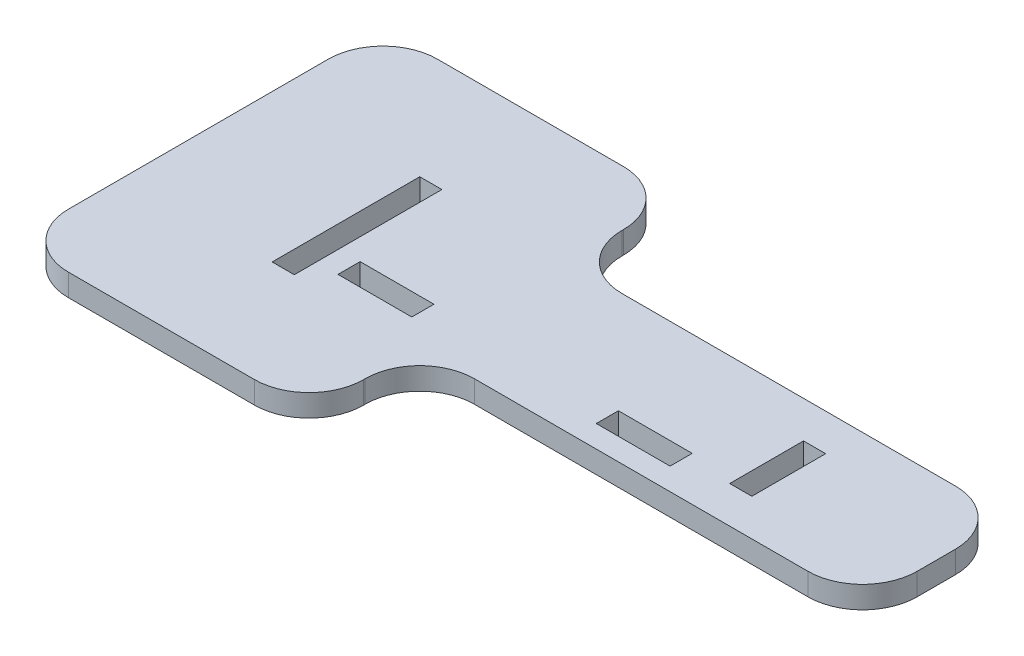
ISO-10303-21;
HEADER;
FILE_DESCRIPTION(('STEP AP214'),'2;1');
FILE_NAME('part.step','',(''),(''),'','','');
FILE_SCHEMA(('AUTOMOTIVE_DESIGN { 1 0 10303 214 1 1 1 1 }'));
ENDSEC;
DATA;
#1=APPLICATION_CONTEXT('core data for automotive mechanical design processes');
#2=APPLICATION_PROTOCOL_DEFINITION('international standard','automotive_design',2000,#1);
#3=PRODUCT_CONTEXT('',#1,'mechanical');
#4=PRODUCT('Part','Part','',(#3));
#5=PRODUCT_RELATED_PRODUCT_CATEGORY('part','',(#4));
#6=PRODUCT_DEFINITION_FORMATION('','',#4);
#7=PRODUCT_DEFINITION_CONTEXT('part definition',#1,'design');
#8=PRODUCT_DEFINITION('design','',#6,#7);
#9=PRODUCT_DEFINITION_SHAPE('','',#8);
#10=(LENGTH_UNIT() NAMED_UNIT(*) SI_UNIT(.MILLI.,.METRE.));
#11=(NAMED_UNIT(*) PLANE_ANGLE_UNIT() SI_UNIT($,.RADIAN.));
#12=(NAMED_UNIT(*) SI_UNIT($,.STERADIAN.) SOLID_ANGLE_UNIT());
#13=UNCERTAINTY_MEASURE_WITH_UNIT(LENGTH_MEASURE(1.E-05),#10,'distance_accuracy_value','');
#14=(GEOMETRIC_REPRESENTATION_CONTEXT(3) GLOBAL_UNCERTAINTY_ASSIGNED_CONTEXT((#13)) GLOBAL_UNIT_ASSIGNED_CONTEXT((#10,
#11,#12)) REPRESENTATION_CONTEXT('',''));
#15=CARTESIAN_POINT('',(0.,0.,0.));
#16=DIRECTION('',(0.,0.,1.));
#17=DIRECTION('',(1.,0.,0.));
#18=AXIS2_PLACEMENT_3D('',#15,#16,#17);
#19=CARTESIAN_POINT('',(0.,3.,0.));
#20=DIRECTION('',(1.,0.,0.));
#21=DIRECTION('',(0.,0.,-1.));
#22=AXIS2_PLACEMENT_3D('',#19,#20,#21);
#23=PLANE('',#22);
#24=DIRECTION('',(0.,0.,1.));
#25=VECTOR('',#24,1.);
#26=CARTESIAN_POINT('',(0.,3.,0.));
#27=LINE('',#26,#25);
#28=CARTESIAN_POINT('',(0.,3.,-42.6));
#29=VERTEX_POINT('',#28);
#30=CARTESIAN_POINT('',(0.,3.,-7.4));
#31=VERTEX_POINT('',#30);
#32=EDGE_CURVE('E400',#29,#31,#27,.T.);
#33=ORIENTED_EDGE('',*,*,#32,.F.);
#34=DIRECTION('',(0.,-1.,0.));
#35=VECTOR('',#34,1.);
#36=CARTESIAN_POINT('',(0.,3.,-42.6));
#37=LINE('',#36,#35);
#38=CARTESIAN_POINT('',(0.,0.,-42.6));
#39=VERTEX_POINT('',#38);
#40=EDGE_CURVE('E425',#29,#39,#37,.T.);
#41=ORIENTED_EDGE('',*,*,#40,.T.);
#42=DIRECTION('',(0.,0.,1.));
#43=VECTOR('',#42,1.);
#44=CARTESIAN_POINT('',(0.,0.,0.));
#45=LINE('',#44,#43);
#46=CARTESIAN_POINT('',(0.,0.,-7.4));
#47=VERTEX_POINT('',#46);
#48=EDGE_CURVE('E383',#39,#47,#45,.T.);
#49=ORIENTED_EDGE('',*,*,#48,.T.);
#50=DIRECTION('',(0.,-1.,0.));
#51=VECTOR('',#50,1.);
#52=CARTESIAN_POINT('',(0.,3.,-7.4));
#53=LINE('',#52,#51);
#54=EDGE_CURVE('E413',#47,#31,#53,.F.);
#55=ORIENTED_EDGE('',*,*,#54,.T.);
#56=EDGE_LOOP('',(#33,#41,#49,#55));
#57=FACE_BOUND('',#56,.T.);
#58=ADVANCED_FACE('F33',(#57),#23,.F.);
#59=CARTESIAN_POINT('',(0.,3.,0.));
#60=DIRECTION('',(0.,0.,-1.));
#61=DIRECTION('',(-1.,0.,0.));
#62=AXIS2_PLACEMENT_3D('',#59,#60,#61);
#63=PLANE('',#62);
#64=DIRECTION('',(1.,0.,0.));
#65=VECTOR('',#64,1.);
#66=CARTESIAN_POINT('',(0.,3.,0.));
#67=LINE('',#66,#65);
#68=CARTESIAN_POINT('',(7.4,3.,0.));
#69=VERTEX_POINT('',#68);
#70=CARTESIAN_POINT('',(32.6,3.,0.));
#71=VERTEX_POINT('',#70);
#72=EDGE_CURVE('E403',#69,#71,#67,.T.);
#73=ORIENTED_EDGE('',*,*,#72,.F.);
#74=DIRECTION('',(0.,-1.,0.));
#75=VECTOR('',#74,1.);
#76=CARTESIAN_POINT('',(7.4,3.,0.));
#77=LINE('',#76,#75);
#78=CARTESIAN_POINT('',(7.4,0.,0.));
#79=VERTEX_POINT('',#78);
#80=EDGE_CURVE('E459',#69,#79,#77,.T.);
#81=ORIENTED_EDGE('',*,*,#80,.T.);
#82=DIRECTION('',(1.,0.,0.));
#83=VECTOR('',#82,1.);
#84=CARTESIAN_POINT('',(0.,0.,0.));
#85=LINE('',#84,#83);
#86=CARTESIAN_POINT('',(32.6,0.,0.));
#87=VERTEX_POINT('',#86);
#88=EDGE_CURVE('E416',#79,#87,#85,.T.);
#89=ORIENTED_EDGE('',*,*,#88,.T.);
#90=DIRECTION('',(0.,1.,0.));
#91=VECTOR('',#90,1.);
#92=CARTESIAN_POINT('',(32.6,3.,0.));
#93=LINE('',#92,#91);
#94=EDGE_CURVE('E456',#87,#71,#93,.T.);
#95=ORIENTED_EDGE('',*,*,#94,.T.);
#96=EDGE_LOOP('',(#73,#81,#89,#95));
#97=FACE_BOUND('',#96,.T.);
#98=ADVANCED_FACE('F515',(#97),#63,.F.);
#99=CARTESIAN_POINT('',(100.,3.,0.));
#100=DIRECTION('',(-1.,0.,0.));
#101=DIRECTION('',(0.,0.,1.));
#102=AXIS2_PLACEMENT_3D('',#99,#100,#101);
#103=PLANE('',#102);
#104=DIRECTION('',(0.,0.,-1.));
#105=VECTOR('',#104,1.);
#106=CARTESIAN_POINT('',(100.,0.,0.));
#107=LINE('',#106,#105);
#108=CARTESIAN_POINT('',(100.,0.,-22.4));
#109=VERTEX_POINT('',#108);
#110=CARTESIAN_POINT('',(100.,0.,-27.6));
#111=VERTEX_POINT('',#110);
#112=EDGE_CURVE('E419',#109,#111,#107,.T.);
#113=ORIENTED_EDGE('',*,*,#112,.T.);
#114=DIRECTION('',(0.,1.,0.));
#115=VECTOR('',#114,1.);
#116=CARTESIAN_POINT('',(100.,3.,-27.6));
#117=LINE('',#116,#115);
#118=CARTESIAN_POINT('',(100.,3.,-27.6));
#119=VERTEX_POINT('',#118);
#120=EDGE_CURVE('E464',#111,#119,#117,.T.);
#121=ORIENTED_EDGE('',*,*,#120,.T.);
#122=DIRECTION('',(0.,0.,-1.));
#123=VECTOR('',#122,1.);
#124=CARTESIAN_POINT('',(100.,3.,0.));
#125=LINE('',#124,#123);
#126=CARTESIAN_POINT('',(100.,3.,-22.4));
#127=VERTEX_POINT('',#126);
#128=EDGE_CURVE('E407',#127,#119,#125,.T.);
#129=ORIENTED_EDGE('',*,*,#128,.F.);
#130=DIRECTION('',(0.,1.,0.));
#131=VECTOR('',#130,1.);
#132=CARTESIAN_POINT('',(100.,3.,-22.4));
#133=LINE('',#132,#131);
#134=EDGE_CURVE('E462',#127,#109,#133,.F.);
#135=ORIENTED_EDGE('',*,*,#134,.T.);
#136=EDGE_LOOP('',(#113,#121,#129,#135));
#137=FACE_BOUND('',#136,.T.);
#138=ADVANCED_FACE('F558',(#137),#103,.F.);
#139=CARTESIAN_POINT('',(0.,3.,-50.));
#140=DIRECTION('',(0.,0.,1.));
#141=DIRECTION('',(1.,0.,0.));
#142=AXIS2_PLACEMENT_3D('',#139,#140,#141);
#143=PLANE('',#142);
#144=DIRECTION('',(-1.,0.,0.));
#145=VECTOR('',#144,1.);
#146=CARTESIAN_POINT('',(0.,0.,-50.));
#147=LINE('',#146,#145);
#148=CARTESIAN_POINT('',(32.6,0.,-50.));
#149=VERTEX_POINT('',#148);
#150=CARTESIAN_POINT('',(7.39999999999998,0.,-50.));
#151=VERTEX_POINT('',#150);
#152=EDGE_CURVE('E404',#149,#151,#147,.T.);
#153=ORIENTED_EDGE('',*,*,#152,.T.);
#154=DIRECTION('',(0.,-1.,0.));
#155=VECTOR('',#154,1.);
#156=CARTESIAN_POINT('',(7.39999999999998,3.,-50.));
#157=LINE('',#156,#155);
#158=CARTESIAN_POINT('',(7.39999999999998,3.,-50.));
#159=VERTEX_POINT('',#158);
#160=EDGE_CURVE('E442',#151,#159,#157,.F.);
#161=ORIENTED_EDGE('',*,*,#160,.T.);
#162=DIRECTION('',(-1.,0.,0.));
#163=VECTOR('',#162,1.);
#164=CARTESIAN_POINT('',(0.,3.,-50.));
#165=LINE('',#164,#163);
#166=CARTESIAN_POINT('',(32.6,3.,-50.));
#167=VERTEX_POINT('',#166);
#168=EDGE_CURVE('E410',#167,#159,#165,.T.);
#169=ORIENTED_EDGE('',*,*,#168,.F.);
#170=DIRECTION('',(0.,1.,0.));
#171=VECTOR('',#170,1.);
#172=CARTESIAN_POINT('',(32.6,3.,-50.));
#173=LINE('',#172,#171);
#174=EDGE_CURVE('E440',#167,#149,#173,.F.);
#175=ORIENTED_EDGE('',*,*,#174,.T.);
#176=EDGE_LOOP('',(#153,#161,#169,#175));
#177=FACE_BOUND('',#176,.T.);
#178=ADVANCED_FACE('F531',(#177),#143,.F.);
#179=CARTESIAN_POINT('',(0.,3.,0.));
#180=DIRECTION('',(0.,-1.,0.));
#181=DIRECTION('',(0.,0.,-1.));
#182=AXIS2_PLACEMENT_3D('',#179,#180,#181);
#183=PLANE('',#182);
#184=DIRECTION('',(-1.,0.,0.));
#185=VECTOR('',#184,1.);
#186=CARTESIAN_POINT('',(25.9197070599803,3.,-18.));
#187=LINE('',#186,#185);
#188=CARTESIAN_POINT('',(35.9197070599803,3.,-18.));
#189=VERTEX_POINT('',#188);
#190=CARTESIAN_POINT('',(25.9197070599803,3.,-18.));
#191=VERTEX_POINT('',#190);
#192=EDGE_CURVE('E253',#189,#191,#187,.T.);
#193=ORIENTED_EDGE('',*,*,#192,.T.);
#194=DIRECTION('',(0.,0.,-1.));
#195=VECTOR('',#194,1.);
#196=CARTESIAN_POINT('',(25.9197070599803,3.,-18.));
#197=LINE('',#196,#195);
#198=CARTESIAN_POINT('',(25.9197070599803,3.,-21.));
#199=VERTEX_POINT('',#198);
#200=EDGE_CURVE('E245',#191,#199,#197,.T.);
#201=ORIENTED_EDGE('',*,*,#200,.T.);
#202=DIRECTION('',(1.,0.,0.));
#203=VECTOR('',#202,1.);
#204=CARTESIAN_POINT('',(25.9197070599803,3.,-21.));
#205=LINE('',#204,#203);
#206=CARTESIAN_POINT('',(35.9197070599803,3.,-21.));
#207=VERTEX_POINT('',#206);
#208=EDGE_CURVE('E256',#199,#207,#205,.T.);
#209=ORIENTED_EDGE('',*,*,#208,.T.);
#210=DIRECTION('',(0.,0.,1.));
#211=VECTOR('',#210,1.);
#212=CARTESIAN_POINT('',(35.9197070599803,3.,-18.));
#213=LINE('',#212,#211);
#214=EDGE_CURVE('E48',#207,#189,#213,.T.);
#215=ORIENTED_EDGE('',*,*,#214,.T.);
#216=EDGE_LOOP('',(#193,#201,#209,#215));
#217=FACE_BOUND('',#216,.T.);
#218=DIRECTION('',(-1.,0.,0.));
#219=VECTOR('',#218,1.);
#220=CARTESIAN_POINT('',(60.9197070599803,3.,-18.));
#221=LINE('',#220,#219);
#222=CARTESIAN_POINT('',(70.9197070599803,3.,-18.));
#223=VERTEX_POINT('',#222);
#224=CARTESIAN_POINT('',(60.9197070599803,3.,-18.));
#225=VERTEX_POINT('',#224);
#226=EDGE_CURVE('E291',#223,#225,#221,.T.);
#227=ORIENTED_EDGE('',*,*,#226,.T.);
#228=DIRECTION('',(0.,0.,-1.));
#229=VECTOR('',#228,1.);
#230=CARTESIAN_POINT('',(60.9197070599803,3.,-18.));
#231=LINE('',#230,#229);
#232=CARTESIAN_POINT('',(60.9197070599803,3.,-21.));
#233=VERTEX_POINT('',#232);
#234=EDGE_CURVE('E283',#225,#233,#231,.T.);
#235=ORIENTED_EDGE('',*,*,#234,.T.);
#236=DIRECTION('',(1.,0.,0.));
#237=VECTOR('',#236,1.);
#238=CARTESIAN_POINT('',(60.9197070599803,3.,-21.));
#239=LINE('',#238,#237);
#240=CARTESIAN_POINT('',(70.9197070599803,3.,-21.));
#241=VERTEX_POINT('',#240);
#242=EDGE_CURVE('E286',#233,#241,#239,.T.);
#243=ORIENTED_EDGE('',*,*,#242,.T.);
#244=DIRECTION('',(0.,0.,1.));
#245=VECTOR('',#244,1.);
#246=CARTESIAN_POINT('',(70.9197070599803,3.,-18.));
#247=LINE('',#246,#245);
#248=EDGE_CURVE('E56',#241,#223,#247,.T.);
#249=ORIENTED_EDGE('',*,*,#248,.T.);
#250=EDGE_LOOP('',(#227,#235,#243,#249));
#251=FACE_BOUND('',#250,.T.);
#252=DIRECTION('',(-1.,0.,0.));
#253=VECTOR('',#252,1.);
#254=CARTESIAN_POINT('',(0.,3.,-15.));
#255=LINE('',#254,#253);
#256=CARTESIAN_POINT('',(23.,3.,-15.));
#257=VERTEX_POINT('',#256);
#258=CARTESIAN_POINT('',(20.,3.,-15.));
#259=VERTEX_POINT('',#258);
#260=EDGE_CURVE('E369',#257,#259,#255,.T.);
#261=ORIENTED_EDGE('',*,*,#260,.T.);
#262=DIRECTION('',(0.,0.,-1.));
#263=VECTOR('',#262,1.);
#264=CARTESIAN_POINT('',(20.,3.,0.));
#265=LINE('',#264,#263);
#266=CARTESIAN_POINT('',(20.,3.,-35.));
#267=VERTEX_POINT('',#266);
#268=EDGE_CURVE('E372',#259,#267,#265,.T.);
#269=ORIENTED_EDGE('',*,*,#268,.T.);
#270=DIRECTION('',(1.,0.,0.));
#271=VECTOR('',#270,1.);
#272=CARTESIAN_POINT('',(0.,3.,-35.));
#273=LINE('',#272,#271);
#274=CARTESIAN_POINT('',(23.,3.,-35.));
#275=VERTEX_POINT('',#274);
#276=EDGE_CURVE('E363',#267,#275,#273,.T.);
#277=ORIENTED_EDGE('',*,*,#276,.T.);
#278=DIRECTION('',(0.,0.,1.));
#279=VECTOR('',#278,1.);
#280=CARTESIAN_POINT('',(23.,3.,0.));
#281=LINE('',#280,#279);
#282=EDGE_CURVE('E366',#275,#257,#281,.T.);
#283=ORIENTED_EDGE('',*,*,#282,.T.);
#284=EDGE_LOOP('',(#261,#269,#277,#283));
#285=FACE_BOUND('',#284,.T.);
#286=DIRECTION('',(-1.,0.,0.));
#287=VECTOR('',#286,1.);
#288=CARTESIAN_POINT('',(0.,3.,-20.));
#289=LINE('',#288,#287);
#290=CARTESIAN_POINT('',(80.,3.,-20.));
#291=VERTEX_POINT('',#290);
#292=CARTESIAN_POINT('',(77.,3.,-20.));
#293=VERTEX_POINT('',#292);
#294=EDGE_CURVE('E357',#291,#293,#289,.T.);
#295=ORIENTED_EDGE('',*,*,#294,.T.);
#296=DIRECTION('',(0.,0.,-1.));
#297=VECTOR('',#296,1.);
#298=CARTESIAN_POINT('',(77.,3.,0.));
#299=LINE('',#298,#297);
#300=CARTESIAN_POINT('',(77.,3.,-30.));
#301=VERTEX_POINT('',#300);
#302=EDGE_CURVE('E360',#293,#301,#299,.T.);
#303=ORIENTED_EDGE('',*,*,#302,.T.);
#304=DIRECTION('',(1.,0.,0.));
#305=VECTOR('',#304,1.);
#306=CARTESIAN_POINT('',(0.,3.,-30.));
#307=LINE('',#306,#305);
#308=CARTESIAN_POINT('',(80.,3.,-30.));
#309=VERTEX_POINT('',#308);
#310=EDGE_CURVE('E327',#301,#309,#307,.T.);
#311=ORIENTED_EDGE('',*,*,#310,.T.);
#312=DIRECTION('',(0.,0.,1.));
#313=VECTOR('',#312,1.);
#314=CARTESIAN_POINT('',(80.,3.,0.));
#315=LINE('',#314,#313);
#316=EDGE_CURVE('E354',#309,#291,#315,.T.);
#317=ORIENTED_EDGE('',*,*,#316,.T.);
#318=EDGE_LOOP('',(#295,#303,#311,#317));
#319=FACE_BOUND('',#318,.T.);
#320=ORIENTED_EDGE('',*,*,#168,.T.);
#321=CARTESIAN_POINT('',(7.39999999999998,3.,-42.6));
#322=DIRECTION('',(0.,-1.,0.));
#323=DIRECTION('',(0.,0.,-1.));
#324=AXIS2_PLACEMENT_3D('',#321,#322,#323);
#325=CIRCLE('',#324,7.4);
#326=EDGE_CURVE('E454',#159,#29,#325,.F.);
#327=ORIENTED_EDGE('',*,*,#326,.T.);
#328=ORIENTED_EDGE('',*,*,#32,.T.);
#329=CARTESIAN_POINT('',(7.4,3.,-7.4));
#330=DIRECTION('',(0.,-1.,0.));
#331=DIRECTION('',(0.,0.,-1.));
#332=AXIS2_PLACEMENT_3D('',#329,#330,#331);
#333=CIRCLE('',#332,7.4);
#334=EDGE_CURVE('E452',#31,#69,#333,.F.);
#335=ORIENTED_EDGE('',*,*,#334,.T.);
#336=ORIENTED_EDGE('',*,*,#72,.T.);
#337=CARTESIAN_POINT('',(32.6,3.,-7.4));
#338=DIRECTION('',(0.,-1.,0.));
#339=DIRECTION('',(0.,0.,-1.));
#340=AXIS2_PLACEMENT_3D('',#337,#338,#339);
#341=CIRCLE('',#340,7.4);
#342=CARTESIAN_POINT('',(40.,3.,-7.4));
#343=VERTEX_POINT('',#342);
#344=EDGE_CURVE('E444',#71,#343,#341,.F.);
#345=ORIENTED_EDGE('',*,*,#344,.T.);
#346=DIRECTION('',(0.,0.,1.));
#347=VECTOR('',#346,1.);
#348=CARTESIAN_POINT('',(40.,3.,0.));
#349=LINE('',#348,#347);
#350=CARTESIAN_POINT('',(40.,3.,-7.59999999999999));
#351=VERTEX_POINT('',#350);
#352=EDGE_CURVE('E380',#351,#343,#349,.T.);
#353=ORIENTED_EDGE('',*,*,#352,.F.);
#354=CARTESIAN_POINT('',(47.4,3.,-7.59999999999999));
#355=DIRECTION('',(0.,-1.,0.));
#356=DIRECTION('',(0.,0.,-1.));
#357=AXIS2_PLACEMENT_3D('',#354,#355,#356);
#358=CIRCLE('',#357,7.4);
#359=CARTESIAN_POINT('',(47.4,3.,-15.));
#360=VERTEX_POINT('',#359);
#361=EDGE_CURVE('E41',#351,#360,#358,.T.);
#362=ORIENTED_EDGE('',*,*,#361,.T.);
#363=DIRECTION('',(-1.,0.,0.));
#364=VECTOR('',#363,1.);
#365=CARTESIAN_POINT('',(100.,3.,-15.));
#366=LINE('',#365,#364);
#367=CARTESIAN_POINT('',(92.6,3.,-15.));
#368=VERTEX_POINT('',#367);
#369=EDGE_CURVE('E384',#368,#360,#366,.T.);
#370=ORIENTED_EDGE('',*,*,#369,.F.);
#371=CARTESIAN_POINT('',(92.6,3.,-22.4));
#372=DIRECTION('',(0.,-1.,0.));
#373=DIRECTION('',(0.,0.,-1.));
#374=AXIS2_PLACEMENT_3D('',#371,#372,#373);
#375=CIRCLE('',#374,7.4);
#376=EDGE_CURVE('E448',#368,#127,#375,.F.);
#377=ORIENTED_EDGE('',*,*,#376,.T.);
#378=ORIENTED_EDGE('',*,*,#128,.T.);
#379=CARTESIAN_POINT('',(92.6,3.,-27.6));
#380=DIRECTION('',(0.,-1.,0.));
#381=DIRECTION('',(0.,0.,-1.));
#382=AXIS2_PLACEMENT_3D('',#379,#380,#381);
#383=CIRCLE('',#382,7.4);
#384=CARTESIAN_POINT('',(92.6,3.,-35.));
#385=VERTEX_POINT('',#384);
#386=EDGE_CURVE('E450',#119,#385,#383,.F.);
#387=ORIENTED_EDGE('',*,*,#386,.T.);
#388=DIRECTION('',(1.,0.,0.));
#389=VECTOR('',#388,1.);
#390=CARTESIAN_POINT('',(100.,3.,-35.));
#391=LINE('',#390,#389);
#392=CARTESIAN_POINT('',(47.4,3.,-35.));
#393=VERTEX_POINT('',#392);
#394=EDGE_CURVE('E393',#393,#385,#391,.T.);
#395=ORIENTED_EDGE('',*,*,#394,.F.);
#396=CARTESIAN_POINT('',(47.4,3.,-42.4));
#397=DIRECTION('',(0.,-1.,0.));
#398=DIRECTION('',(0.,0.,-1.));
#399=AXIS2_PLACEMENT_3D('',#396,#397,#398);
#400=CIRCLE('',#399,7.4);
#401=CARTESIAN_POINT('',(40.,3.,-42.4));
#402=VERTEX_POINT('',#401);
#403=EDGE_CURVE('E487',#393,#402,#400,.T.);
#404=ORIENTED_EDGE('',*,*,#403,.T.);
#405=DIRECTION('',(0.,0.,1.));
#406=VECTOR('',#405,1.);
#407=CARTESIAN_POINT('',(40.,3.,-50.));
#408=LINE('',#407,#406);
#409=CARTESIAN_POINT('',(40.,3.,-42.6));
#410=VERTEX_POINT('',#409);
#411=EDGE_CURVE('E375',#410,#402,#408,.T.);
#412=ORIENTED_EDGE('',*,*,#411,.F.);
#413=CARTESIAN_POINT('',(32.6,3.,-42.6));
#414=DIRECTION('',(0.,-1.,0.));
#415=DIRECTION('',(0.,0.,-1.));
#416=AXIS2_PLACEMENT_3D('',#413,#414,#415);
#417=CIRCLE('',#416,7.4);
#418=EDGE_CURVE('E446',#410,#167,#417,.F.);
#419=ORIENTED_EDGE('',*,*,#418,.T.);
#420=EDGE_LOOP('',(#320,#327,#328,#335,#336,#345,#353,#362,#370,#377,#378,#387,#395,#404,#412,#419));
#421=FACE_BOUND('',#420,.T.);
#422=ADVANCED_FACE('F260',(#217,#251,#285,#319,#421),#183,.F.);
#423=CARTESIAN_POINT('',(0.,0.,0.));
#424=DIRECTION('',(0.,-1.,0.));
#425=DIRECTION('',(0.,0.,-1.));
#426=AXIS2_PLACEMENT_3D('',#423,#424,#425);
#427=PLANE('',#426);
#428=DIRECTION('',(0.,0.,-1.));
#429=VECTOR('',#428,1.);
#430=CARTESIAN_POINT('',(25.9197070599803,0.,-18.));
#431=LINE('',#430,#429);
#432=CARTESIAN_POINT('',(25.9197070599803,0.,-18.));
#433=VERTEX_POINT('',#432);
#434=CARTESIAN_POINT('',(25.9197070599803,0.,-21.));
#435=VERTEX_POINT('',#434);
#436=EDGE_CURVE('E248',#433,#435,#431,.T.);
#437=ORIENTED_EDGE('',*,*,#436,.F.);
#438=DIRECTION('',(-1.,0.,0.));
#439=VECTOR('',#438,1.);
#440=CARTESIAN_POINT('',(25.9197070599803,0.,-18.));
#441=LINE('',#440,#439);
#442=CARTESIAN_POINT('',(35.9197070599803,0.,-18.));
#443=VERTEX_POINT('',#442);
#444=EDGE_CURVE('E263',#443,#433,#441,.T.);
#445=ORIENTED_EDGE('',*,*,#444,.F.);
#446=DIRECTION('',(0.,0.,1.));
#447=VECTOR('',#446,1.);
#448=CARTESIAN_POINT('',(35.9197070599803,0.,-18.));
#449=LINE('',#448,#447);
#450=CARTESIAN_POINT('',(35.9197070599803,0.,-21.));
#451=VERTEX_POINT('',#450);
#452=EDGE_CURVE('E266',#451,#443,#449,.T.);
#453=ORIENTED_EDGE('',*,*,#452,.F.);
#454=DIRECTION('',(1.,0.,0.));
#455=VECTOR('',#454,1.);
#456=CARTESIAN_POINT('',(25.9197070599803,0.,-21.));
#457=LINE('',#456,#455);
#458=EDGE_CURVE('E272',#435,#451,#457,.T.);
#459=ORIENTED_EDGE('',*,*,#458,.F.);
#460=EDGE_LOOP('',(#437,#445,#453,#459));
#461=FACE_BOUND('',#460,.T.);
#462=DIRECTION('',(0.,0.,-1.));
#463=VECTOR('',#462,1.);
#464=CARTESIAN_POINT('',(60.9197070599803,0.,-18.));
#465=LINE('',#464,#463);
#466=CARTESIAN_POINT('',(60.9197070599803,0.,-18.));
#467=VERTEX_POINT('',#466);
#468=CARTESIAN_POINT('',(60.9197070599803,0.,-21.));
#469=VERTEX_POINT('',#468);
#470=EDGE_CURVE('E295',#467,#469,#465,.T.);
#471=ORIENTED_EDGE('',*,*,#470,.F.);
#472=DIRECTION('',(-1.,0.,0.));
#473=VECTOR('',#472,1.);
#474=CARTESIAN_POINT('',(60.9197070599803,0.,-18.));
#475=LINE('',#474,#473);
#476=CARTESIAN_POINT('',(70.9197070599803,0.,-18.));
#477=VERTEX_POINT('',#476);
#478=EDGE_CURVE('E287',#477,#467,#475,.T.);
#479=ORIENTED_EDGE('',*,*,#478,.F.);
#480=DIRECTION('',(0.,0.,1.));
#481=VECTOR('',#480,1.);
#482=CARTESIAN_POINT('',(70.9197070599803,0.,-18.));
#483=LINE('',#482,#481);
#484=CARTESIAN_POINT('',(70.9197070599803,0.,-21.));
#485=VERTEX_POINT('',#484);
#486=EDGE_CURVE('E300',#485,#477,#483,.T.);
#487=ORIENTED_EDGE('',*,*,#486,.F.);
#488=DIRECTION('',(1.,0.,0.));
#489=VECTOR('',#488,1.);
#490=CARTESIAN_POINT('',(60.9197070599803,0.,-21.));
#491=LINE('',#490,#489);
#492=EDGE_CURVE('E297',#469,#485,#491,.T.);
#493=ORIENTED_EDGE('',*,*,#492,.F.);
#494=EDGE_LOOP('',(#471,#479,#487,#493));
#495=FACE_BOUND('',#494,.T.);
#496=DIRECTION('',(0.,0.,-1.));
#497=VECTOR('',#496,1.);
#498=CARTESIAN_POINT('',(20.,0.,-15.));
#499=LINE('',#498,#497);
#500=CARTESIAN_POINT('',(20.,0.,-15.));
#501=VERTEX_POINT('',#500);
#502=CARTESIAN_POINT('',(20.,0.,-35.));
#503=VERTEX_POINT('',#502);
#504=EDGE_CURVE('E312',#501,#503,#499,.T.);
#505=ORIENTED_EDGE('',*,*,#504,.F.);
#506=DIRECTION('',(-1.,0.,0.));
#507=VECTOR('',#506,1.);
#508=CARTESIAN_POINT('',(20.,0.,-15.));
#509=LINE('',#508,#507);
#510=CARTESIAN_POINT('',(23.,0.,-15.));
#511=VERTEX_POINT('',#510);
#512=EDGE_CURVE('E321',#511,#501,#509,.T.);
#513=ORIENTED_EDGE('',*,*,#512,.F.);
#514=DIRECTION('',(0.,0.,1.));
#515=VECTOR('',#514,1.);
#516=CARTESIAN_POINT('',(23.,0.,-15.));
#517=LINE('',#516,#515);
#518=CARTESIAN_POINT('',(23.,0.,-35.));
#519=VERTEX_POINT('',#518);
#520=EDGE_CURVE('E318',#519,#511,#517,.T.);
#521=ORIENTED_EDGE('',*,*,#520,.F.);
#522=DIRECTION('',(1.,0.,0.));
#523=VECTOR('',#522,1.);
#524=CARTESIAN_POINT('',(20.,0.,-35.));
#525=LINE('',#524,#523);
#526=EDGE_CURVE('E314',#503,#519,#525,.T.);
#527=ORIENTED_EDGE('',*,*,#526,.F.);
#528=EDGE_LOOP('',(#505,#513,#521,#527));
#529=FACE_BOUND('',#528,.T.);
#530=DIRECTION('',(0.,0.,-1.));
#531=VECTOR('',#530,1.);
#532=CARTESIAN_POINT('',(77.,0.,-20.));
#533=LINE('',#532,#531);
#534=CARTESIAN_POINT('',(77.,0.,-20.));
#535=VERTEX_POINT('',#534);
#536=CARTESIAN_POINT('',(77.,0.,-30.));
#537=VERTEX_POINT('',#536);
#538=EDGE_CURVE('E279',#535,#537,#533,.T.);
#539=ORIENTED_EDGE('',*,*,#538,.F.);
#540=DIRECTION('',(-1.,0.,0.));
#541=VECTOR('',#540,1.);
#542=CARTESIAN_POINT('',(77.,0.,-20.));
#543=LINE('',#542,#541);
#544=CARTESIAN_POINT('',(80.,0.,-20.));
#545=VERTEX_POINT('',#544);
#546=EDGE_CURVE('E341',#545,#535,#543,.T.);
#547=ORIENTED_EDGE('',*,*,#546,.F.);
#548=DIRECTION('',(0.,0.,1.));
#549=VECTOR('',#548,1.);
#550=CARTESIAN_POINT('',(80.,0.,-20.));
#551=LINE('',#550,#549);
#552=CARTESIAN_POINT('',(80.,0.,-30.));
#553=VERTEX_POINT('',#552);
#554=EDGE_CURVE('E338',#553,#545,#551,.T.);
#555=ORIENTED_EDGE('',*,*,#554,.F.);
#556=DIRECTION('',(1.,0.,0.));
#557=VECTOR('',#556,1.);
#558=CARTESIAN_POINT('',(77.,0.,-30.));
#559=LINE('',#558,#557);
#560=EDGE_CURVE('E335',#537,#553,#559,.T.);
#561=ORIENTED_EDGE('',*,*,#560,.F.);
#562=EDGE_LOOP('',(#539,#547,#555,#561));
#563=FACE_BOUND('',#562,.T.);
#564=ORIENTED_EDGE('',*,*,#48,.F.);
#565=CARTESIAN_POINT('',(7.39999999999998,0.,-42.6));
#566=DIRECTION('',(0.,-1.,0.));
#567=DIRECTION('',(0.,0.,-1.));
#568=AXIS2_PLACEMENT_3D('',#565,#566,#567);
#569=CIRCLE('',#568,7.4);
#570=EDGE_CURVE('E438',#39,#151,#569,.T.);
#571=ORIENTED_EDGE('',*,*,#570,.T.);
#572=ORIENTED_EDGE('',*,*,#152,.F.);
#573=CARTESIAN_POINT('',(32.6,0.,-42.6));
#574=DIRECTION('',(0.,-1.,0.));
#575=DIRECTION('',(0.,0.,-1.));
#576=AXIS2_PLACEMENT_3D('',#573,#574,#575);
#577=CIRCLE('',#576,7.4);
#578=CARTESIAN_POINT('',(40.,0.,-42.6));
#579=VERTEX_POINT('',#578);
#580=EDGE_CURVE('E430',#149,#579,#577,.T.);
#581=ORIENTED_EDGE('',*,*,#580,.T.);
#582=DIRECTION('',(0.,0.,1.));
#583=VECTOR('',#582,1.);
#584=CARTESIAN_POINT('',(40.,0.,-50.));
#585=LINE('',#584,#583);
#586=CARTESIAN_POINT('',(40.,0.,-42.4));
#587=VERTEX_POINT('',#586);
#588=EDGE_CURVE('E390',#579,#587,#585,.T.);
#589=ORIENTED_EDGE('',*,*,#588,.T.);
#590=CARTESIAN_POINT('',(47.4,0.,-42.4));
#591=DIRECTION('',(0.,-1.,0.));
#592=DIRECTION('',(0.,0.,-1.));
#593=AXIS2_PLACEMENT_3D('',#590,#591,#592);
#594=CIRCLE('',#593,7.4);
#595=CARTESIAN_POINT('',(47.4,0.,-35.));
#596=VERTEX_POINT('',#595);
#597=EDGE_CURVE('E489',#587,#596,#594,.F.);
#598=ORIENTED_EDGE('',*,*,#597,.T.);
#599=DIRECTION('',(1.,0.,0.));
#600=VECTOR('',#599,1.);
#601=CARTESIAN_POINT('',(100.,0.,-35.));
#602=LINE('',#601,#600);
#603=CARTESIAN_POINT('',(92.6,0.,-35.));
#604=VERTEX_POINT('',#603);
#605=EDGE_CURVE('E387',#596,#604,#602,.T.);
#606=ORIENTED_EDGE('',*,*,#605,.T.);
#607=CARTESIAN_POINT('',(92.6,0.,-27.6));
#608=DIRECTION('',(0.,-1.,0.));
#609=DIRECTION('',(0.,0.,-1.));
#610=AXIS2_PLACEMENT_3D('',#607,#608,#609);
#611=CIRCLE('',#610,7.4);
#612=EDGE_CURVE('E434',#604,#111,#611,.T.);
#613=ORIENTED_EDGE('',*,*,#612,.T.);
#614=ORIENTED_EDGE('',*,*,#112,.F.);
#615=CARTESIAN_POINT('',(92.6,0.,-22.4));
#616=DIRECTION('',(0.,-1.,0.));
#617=DIRECTION('',(0.,0.,-1.));
#618=AXIS2_PLACEMENT_3D('',#615,#616,#617);
#619=CIRCLE('',#618,7.4);
#620=CARTESIAN_POINT('',(92.6,0.,-15.));
#621=VERTEX_POINT('',#620);
#622=EDGE_CURVE('E432',#109,#621,#619,.T.);
#623=ORIENTED_EDGE('',*,*,#622,.T.);
#624=DIRECTION('',(-1.,0.,0.));
#625=VECTOR('',#624,1.);
#626=CARTESIAN_POINT('',(100.,0.,-15.));
#627=LINE('',#626,#625);
#628=CARTESIAN_POINT('',(47.4,0.,-15.));
#629=VERTEX_POINT('',#628);
#630=EDGE_CURVE('E376',#621,#629,#627,.T.);
#631=ORIENTED_EDGE('',*,*,#630,.T.);
#632=CARTESIAN_POINT('',(47.4,0.,-7.59999999999999));
#633=DIRECTION('',(0.,-1.,0.));
#634=DIRECTION('',(0.,0.,-1.));
#635=AXIS2_PLACEMENT_3D('',#632,#633,#634);
#636=CIRCLE('',#635,7.4);
#637=CARTESIAN_POINT('',(40.,0.,-7.59999999999999));
#638=VERTEX_POINT('',#637);
#639=EDGE_CURVE('E11',#629,#638,#636,.F.);
#640=ORIENTED_EDGE('',*,*,#639,.T.);
#641=DIRECTION('',(0.,0.,1.));
#642=VECTOR('',#641,1.);
#643=CARTESIAN_POINT('',(40.,0.,0.));
#644=LINE('',#643,#642);
#645=CARTESIAN_POINT('',(40.,0.,-7.4));
#646=VERTEX_POINT('',#645);
#647=EDGE_CURVE('E379',#638,#646,#644,.T.);
#648=ORIENTED_EDGE('',*,*,#647,.T.);
#649=CARTESIAN_POINT('',(32.6,0.,-7.4));
#650=DIRECTION('',(0.,-1.,0.));
#651=DIRECTION('',(0.,0.,-1.));
#652=AXIS2_PLACEMENT_3D('',#649,#650,#651);
#653=CIRCLE('',#652,7.4);
#654=EDGE_CURVE('E428',#646,#87,#653,.T.);
#655=ORIENTED_EDGE('',*,*,#654,.T.);
#656=ORIENTED_EDGE('',*,*,#88,.F.);
#657=CARTESIAN_POINT('',(7.4,0.,-7.4));
#658=DIRECTION('',(0.,-1.,0.));
#659=DIRECTION('',(0.,0.,-1.));
#660=AXIS2_PLACEMENT_3D('',#657,#658,#659);
#661=CIRCLE('',#660,7.4);
#662=EDGE_CURVE('E436',#79,#47,#661,.T.);
#663=ORIENTED_EDGE('',*,*,#662,.T.);
#664=EDGE_LOOP('',(#564,#571,#572,#581,#589,#598,#606,#613,#614,#623,#631,#640,#648,#655,#656,#663));
#665=FACE_BOUND('',#664,.T.);
#666=ADVANCED_FACE('F504',(#461,#495,#529,#563,#665),#427,.T.);
#667=CARTESIAN_POINT('',(100.,0.,-35.));
#668=DIRECTION('',(0.,0.,1.));
#669=DIRECTION('',(1.,0.,0.));
#670=AXIS2_PLACEMENT_3D('',#667,#668,#669);
#671=PLANE('',#670);
#672=ORIENTED_EDGE('',*,*,#394,.T.);
#673=DIRECTION('',(0.,1.,0.));
#674=VECTOR('',#673,1.);
#675=CARTESIAN_POINT('',(92.6,0.,-35.));
#676=LINE('',#675,#674);
#677=EDGE_CURVE('E470',#385,#604,#676,.F.);
#678=ORIENTED_EDGE('',*,*,#677,.T.);
#679=ORIENTED_EDGE('',*,*,#605,.F.);
#680=DIRECTION('',(0.,1.,0.));
#681=VECTOR('',#680,1.);
#682=CARTESIAN_POINT('',(47.4,3.,-35.));
#683=LINE('',#682,#681);
#684=EDGE_CURVE('E467',#596,#393,#683,.T.);
#685=ORIENTED_EDGE('',*,*,#684,.T.);
#686=EDGE_LOOP('',(#672,#678,#679,#685));
#687=FACE_BOUND('',#686,.T.);
#688=ADVANCED_FACE('F549',(#687),#671,.F.);
#689=CARTESIAN_POINT('',(40.,0.,-50.));
#690=DIRECTION('',(-1.,0.,0.));
#691=DIRECTION('',(0.,0.,1.));
#692=AXIS2_PLACEMENT_3D('',#689,#690,#691);
#693=PLANE('',#692);
#694=ORIENTED_EDGE('',*,*,#411,.T.);
#695=DIRECTION('',(0.,1.,0.));
#696=VECTOR('',#695,1.);
#697=CARTESIAN_POINT('',(40.,0.,-42.4));
#698=LINE('',#697,#696);
#699=EDGE_CURVE('E480',#402,#587,#698,.F.);
#700=ORIENTED_EDGE('',*,*,#699,.T.);
#701=ORIENTED_EDGE('',*,*,#588,.F.);
#702=DIRECTION('',(0.,1.,0.));
#703=VECTOR('',#702,1.);
#704=CARTESIAN_POINT('',(40.,0.,-42.6));
#705=LINE('',#704,#703);
#706=EDGE_CURVE('E477',#579,#410,#705,.T.);
#707=ORIENTED_EDGE('',*,*,#706,.T.);
#708=EDGE_LOOP('',(#694,#700,#701,#707));
#709=FACE_BOUND('',#708,.T.);
#710=ADVANCED_FACE('F540',(#709),#693,.F.);
#711=CARTESIAN_POINT('',(40.,0.,0.));
#712=DIRECTION('',(-1.,0.,0.));
#713=DIRECTION('',(0.,0.,1.));
#714=AXIS2_PLACEMENT_3D('',#711,#712,#713);
#715=PLANE('',#714);
#716=ORIENTED_EDGE('',*,*,#352,.T.);
#717=DIRECTION('',(0.,1.,0.));
#718=VECTOR('',#717,1.);
#719=CARTESIAN_POINT('',(40.,0.,-7.4));
#720=LINE('',#719,#718);
#721=EDGE_CURVE('E485',#343,#646,#720,.F.);
#722=ORIENTED_EDGE('',*,*,#721,.T.);
#723=ORIENTED_EDGE('',*,*,#647,.F.);
#724=DIRECTION('',(0.,1.,0.));
#725=VECTOR('',#724,1.);
#726=CARTESIAN_POINT('',(40.,3.,-7.59999999999999));
#727=LINE('',#726,#725);
#728=EDGE_CURVE('E482',#638,#351,#727,.T.);
#729=ORIENTED_EDGE('',*,*,#728,.T.);
#730=EDGE_LOOP('',(#716,#722,#723,#729));
#731=FACE_BOUND('',#730,.T.);
#732=ADVANCED_FACE('F507',(#731),#715,.F.);
#733=CARTESIAN_POINT('',(100.,0.,-15.));
#734=DIRECTION('',(0.,0.,-1.));
#735=DIRECTION('',(-1.,0.,0.));
#736=AXIS2_PLACEMENT_3D('',#733,#734,#735);
#737=PLANE('',#736);
#738=ORIENTED_EDGE('',*,*,#630,.F.);
#739=DIRECTION('',(0.,1.,0.));
#740=VECTOR('',#739,1.);
#741=CARTESIAN_POINT('',(92.6,0.,-15.));
#742=LINE('',#741,#740);
#743=EDGE_CURVE('E474',#621,#368,#742,.T.);
#744=ORIENTED_EDGE('',*,*,#743,.T.);
#745=ORIENTED_EDGE('',*,*,#369,.T.);
#746=DIRECTION('',(0.,1.,0.));
#747=VECTOR('',#746,1.);
#748=CARTESIAN_POINT('',(47.4,0.,-15.));
#749=LINE('',#748,#747);
#750=EDGE_CURVE('E472',#360,#629,#749,.F.);
#751=ORIENTED_EDGE('',*,*,#750,.T.);
#752=EDGE_LOOP('',(#738,#744,#745,#751));
#753=FACE_BOUND('',#752,.T.);
#754=ADVANCED_FACE('F498',(#753),#737,.F.);
#755=CARTESIAN_POINT('',(7.39999999999998,3.,-42.6));
#756=DIRECTION('',(0.,-1.,0.));
#757=DIRECTION('',(0.,0.,-1.));
#758=AXIS2_PLACEMENT_3D('',#755,#756,#757);
#759=CYLINDRICAL_SURFACE('',#758,7.4);
#760=ORIENTED_EDGE('',*,*,#326,.F.);
#761=ORIENTED_EDGE('',*,*,#160,.F.);
#762=ORIENTED_EDGE('',*,*,#570,.F.);
#763=ORIENTED_EDGE('',*,*,#40,.F.);
#764=EDGE_LOOP('',(#760,#761,#762,#763));
#765=FACE_BOUND('',#764,.T.);
#766=ADVANCED_FACE('F526',(#765),#759,.T.);
#767=CARTESIAN_POINT('',(7.4,3.,-7.4));
#768=DIRECTION('',(0.,-1.,0.));
#769=DIRECTION('',(0.,0.,-1.));
#770=AXIS2_PLACEMENT_3D('',#767,#768,#769);
#771=CYLINDRICAL_SURFACE('',#770,7.4);
#772=ORIENTED_EDGE('',*,*,#334,.F.);
#773=ORIENTED_EDGE('',*,*,#54,.F.);
#774=ORIENTED_EDGE('',*,*,#662,.F.);
#775=ORIENTED_EDGE('',*,*,#80,.F.);
#776=EDGE_LOOP('',(#772,#773,#774,#775));
#777=FACE_BOUND('',#776,.T.);
#778=ADVANCED_FACE('F519',(#777),#771,.T.);
#779=CARTESIAN_POINT('',(92.6,3.,-27.6));
#780=DIRECTION('',(0.,1.,0.));
#781=DIRECTION('',(0.,0.,1.));
#782=AXIS2_PLACEMENT_3D('',#779,#780,#781);
#783=CYLINDRICAL_SURFACE('',#782,7.4);
#784=ORIENTED_EDGE('',*,*,#612,.F.);
#785=ORIENTED_EDGE('',*,*,#677,.F.);
#786=ORIENTED_EDGE('',*,*,#386,.F.);
#787=ORIENTED_EDGE('',*,*,#120,.F.);
#788=EDGE_LOOP('',(#784,#785,#786,#787));
#789=FACE_BOUND('',#788,.T.);
#790=ADVANCED_FACE('F553',(#789),#783,.T.);
#791=CARTESIAN_POINT('',(92.6,0.,-22.4));
#792=DIRECTION('',(0.,1.,0.));
#793=DIRECTION('',(0.,0.,1.));
#794=AXIS2_PLACEMENT_3D('',#791,#792,#793);
#795=CYLINDRICAL_SURFACE('',#794,7.4);
#796=ORIENTED_EDGE('',*,*,#622,.F.);
#797=ORIENTED_EDGE('',*,*,#134,.F.);
#798=ORIENTED_EDGE('',*,*,#376,.F.);
#799=ORIENTED_EDGE('',*,*,#743,.F.);
#800=EDGE_LOOP('',(#796,#797,#798,#799));
#801=FACE_BOUND('',#800,.T.);
#802=ADVANCED_FACE('F562',(#801),#795,.T.);
#803=CARTESIAN_POINT('',(47.4,0.,-42.4));
#804=DIRECTION('',(0.,-1.,0.));
#805=DIRECTION('',(0.,0.,-1.));
#806=AXIS2_PLACEMENT_3D('',#803,#804,#805);
#807=CYLINDRICAL_SURFACE('',#806,7.4);
#808=ORIENTED_EDGE('',*,*,#597,.F.);
#809=ORIENTED_EDGE('',*,*,#699,.F.);
#810=ORIENTED_EDGE('',*,*,#403,.F.);
#811=ORIENTED_EDGE('',*,*,#684,.F.);
#812=EDGE_LOOP('',(#808,#809,#810,#811));
#813=FACE_BOUND('',#812,.T.);
#814=ADVANCED_FACE('F544',(#813),#807,.F.);
#815=CARTESIAN_POINT('',(32.6,0.,-42.6));
#816=DIRECTION('',(0.,1.,0.));
#817=DIRECTION('',(0.,0.,1.));
#818=AXIS2_PLACEMENT_3D('',#815,#816,#817);
#819=CYLINDRICAL_SURFACE('',#818,7.4);
#820=ORIENTED_EDGE('',*,*,#580,.F.);
#821=ORIENTED_EDGE('',*,*,#174,.F.);
#822=ORIENTED_EDGE('',*,*,#418,.F.);
#823=ORIENTED_EDGE('',*,*,#706,.F.);
#824=EDGE_LOOP('',(#820,#821,#822,#823));
#825=FACE_BOUND('',#824,.T.);
#826=ADVANCED_FACE('F535',(#825),#819,.T.);
#827=CARTESIAN_POINT('',(32.6,3.,-7.4));
#828=DIRECTION('',(0.,1.,0.));
#829=DIRECTION('',(0.,0.,1.));
#830=AXIS2_PLACEMENT_3D('',#827,#828,#829);
#831=CYLINDRICAL_SURFACE('',#830,7.4);
#832=ORIENTED_EDGE('',*,*,#654,.F.);
#833=ORIENTED_EDGE('',*,*,#721,.F.);
#834=ORIENTED_EDGE('',*,*,#344,.F.);
#835=ORIENTED_EDGE('',*,*,#94,.F.);
#836=EDGE_LOOP('',(#832,#833,#834,#835));
#837=FACE_BOUND('',#836,.T.);
#838=ADVANCED_FACE('F510',(#837),#831,.T.);
#839=CARTESIAN_POINT('',(47.4,0.,-7.59999999999999));
#840=DIRECTION('',(0.,-1.,0.));
#841=DIRECTION('',(0.,0.,-1.));
#842=AXIS2_PLACEMENT_3D('',#839,#840,#841);
#843=CYLINDRICAL_SURFACE('',#842,7.4);
#844=ORIENTED_EDGE('',*,*,#639,.F.);
#845=ORIENTED_EDGE('',*,*,#750,.F.);
#846=ORIENTED_EDGE('',*,*,#361,.F.);
#847=ORIENTED_EDGE('',*,*,#728,.F.);
#848=EDGE_LOOP('',(#844,#845,#846,#847));
#849=FACE_BOUND('',#848,.T.);
#850=ADVANCED_FACE('F35',(#849),#843,.F.);
#851=CARTESIAN_POINT('',(77.,10.,-20.));
#852=DIRECTION('',(-1.,0.,0.));
#853=DIRECTION('',(0.,0.,1.));
#854=AXIS2_PLACEMENT_3D('',#851,#852,#853);
#855=PLANE('',#854);
#856=DIRECTION('',(0.,-1.,0.));
#857=VECTOR('',#856,1.);
#858=CARTESIAN_POINT('',(77.,10.,-20.));
#859=LINE('',#858,#857);
#860=EDGE_CURVE('E315',#293,#535,#859,.T.);
#861=ORIENTED_EDGE('',*,*,#860,.T.);
#862=ORIENTED_EDGE('',*,*,#538,.T.);
#863=DIRECTION('',(0.,-1.,0.));
#864=VECTOR('',#863,1.);
#865=CARTESIAN_POINT('',(77.,10.,-30.));
#866=LINE('',#865,#864);
#867=EDGE_CURVE('E344',#301,#537,#866,.T.);
#868=ORIENTED_EDGE('',*,*,#867,.F.);
#869=ORIENTED_EDGE('',*,*,#302,.F.);
#870=EDGE_LOOP('',(#861,#862,#868,#869));
#871=FACE_BOUND('',#870,.T.);
#872=ADVANCED_FACE('F625',(#871),#855,.F.);
#873=CARTESIAN_POINT('',(77.,10.,-20.));
#874=DIRECTION('',(0.,0.,1.));
#875=DIRECTION('',(1.,0.,0.));
#876=AXIS2_PLACEMENT_3D('',#873,#874,#875);
#877=PLANE('',#876);
#878=DIRECTION('',(0.,-1.,0.));
#879=VECTOR('',#878,1.);
#880=CARTESIAN_POINT('',(80.,10.,-20.));
#881=LINE('',#880,#879);
#882=EDGE_CURVE('E346',#291,#545,#881,.T.);
#883=ORIENTED_EDGE('',*,*,#882,.T.);
#884=ORIENTED_EDGE('',*,*,#546,.T.);
#885=ORIENTED_EDGE('',*,*,#860,.F.);
#886=ORIENTED_EDGE('',*,*,#294,.F.);
#887=EDGE_LOOP('',(#883,#884,#885,#886));
#888=FACE_BOUND('',#887,.T.);
#889=ADVANCED_FACE('F633',(#888),#877,.F.);
#890=CARTESIAN_POINT('',(80.,10.,-20.));
#891=DIRECTION('',(1.,0.,0.));
#892=DIRECTION('',(0.,0.,-1.));
#893=AXIS2_PLACEMENT_3D('',#890,#891,#892);
#894=PLANE('',#893);
#895=DIRECTION('',(0.,-1.,0.));
#896=VECTOR('',#895,1.);
#897=CARTESIAN_POINT('',(80.,10.,-30.));
#898=LINE('',#897,#896);
#899=EDGE_CURVE('E348',#309,#553,#898,.T.);
#900=ORIENTED_EDGE('',*,*,#899,.T.);
#901=ORIENTED_EDGE('',*,*,#554,.T.);
#902=ORIENTED_EDGE('',*,*,#882,.F.);
#903=ORIENTED_EDGE('',*,*,#316,.F.);
#904=EDGE_LOOP('',(#900,#901,#902,#903));
#905=FACE_BOUND('',#904,.T.);
#906=ADVANCED_FACE('F643',(#905),#894,.F.);
#907=CARTESIAN_POINT('',(77.,10.,-30.));
#908=DIRECTION('',(0.,0.,-1.));
#909=DIRECTION('',(-1.,0.,0.));
#910=AXIS2_PLACEMENT_3D('',#907,#908,#909);
#911=PLANE('',#910);
#912=ORIENTED_EDGE('',*,*,#867,.T.);
#913=ORIENTED_EDGE('',*,*,#560,.T.);
#914=ORIENTED_EDGE('',*,*,#899,.F.);
#915=ORIENTED_EDGE('',*,*,#310,.F.);
#916=EDGE_LOOP('',(#912,#913,#914,#915));
#917=FACE_BOUND('',#916,.T.);
#918=ADVANCED_FACE('F653',(#917),#911,.F.);
#919=CARTESIAN_POINT('',(20.,10.,-15.));
#920=DIRECTION('',(-1.,0.,0.));
#921=DIRECTION('',(0.,0.,1.));
#922=AXIS2_PLACEMENT_3D('',#919,#920,#921);
#923=PLANE('',#922);
#924=DIRECTION('',(0.,-1.,0.));
#925=VECTOR('',#924,1.);
#926=CARTESIAN_POINT('',(20.,10.,-15.));
#927=LINE('',#926,#925);
#928=EDGE_CURVE('E325',#259,#501,#927,.T.);
#929=ORIENTED_EDGE('',*,*,#928,.T.);
#930=ORIENTED_EDGE('',*,*,#504,.T.);
#931=DIRECTION('',(0.,-1.,0.));
#932=VECTOR('',#931,1.);
#933=CARTESIAN_POINT('',(20.,10.,-35.));
#934=LINE('',#933,#932);
#935=EDGE_CURVE('E324',#267,#503,#934,.T.);
#936=ORIENTED_EDGE('',*,*,#935,.F.);
#937=ORIENTED_EDGE('',*,*,#268,.F.);
#938=EDGE_LOOP('',(#929,#930,#936,#937));
#939=FACE_BOUND('',#938,.T.);
#940=ADVANCED_FACE('F663',(#939),#923,.F.);
#941=CARTESIAN_POINT('',(20.,10.,-15.));
#942=DIRECTION('',(0.,0.,1.));
#943=DIRECTION('',(1.,0.,0.));
#944=AXIS2_PLACEMENT_3D('',#941,#942,#943);
#945=PLANE('',#944);
#946=DIRECTION('',(0.,-1.,0.));
#947=VECTOR('',#946,1.);
#948=CARTESIAN_POINT('',(23.,10.,-15.));
#949=LINE('',#948,#947);
#950=EDGE_CURVE('E328',#257,#511,#949,.T.);
#951=ORIENTED_EDGE('',*,*,#950,.T.);
#952=ORIENTED_EDGE('',*,*,#512,.T.);
#953=ORIENTED_EDGE('',*,*,#928,.F.);
#954=ORIENTED_EDGE('',*,*,#260,.F.);
#955=EDGE_LOOP('',(#951,#952,#953,#954));
#956=FACE_BOUND('',#955,.T.);
#957=ADVANCED_FACE('F673',(#956),#945,.F.);
#958=CARTESIAN_POINT('',(23.,10.,-15.));
#959=DIRECTION('',(1.,0.,0.));
#960=DIRECTION('',(0.,0.,-1.));
#961=AXIS2_PLACEMENT_3D('',#958,#959,#960);
#962=PLANE('',#961);
#963=DIRECTION('',(0.,-1.,0.));
#964=VECTOR('',#963,1.);
#965=CARTESIAN_POINT('',(23.,10.,-35.));
#966=LINE('',#965,#964);
#967=EDGE_CURVE('E330',#275,#519,#966,.T.);
#968=ORIENTED_EDGE('',*,*,#967,.T.);
#969=ORIENTED_EDGE('',*,*,#520,.T.);
#970=ORIENTED_EDGE('',*,*,#950,.F.);
#971=ORIENTED_EDGE('',*,*,#282,.F.);
#972=EDGE_LOOP('',(#968,#969,#970,#971));
#973=FACE_BOUND('',#972,.T.);
#974=ADVANCED_FACE('F683',(#973),#962,.F.);
#975=CARTESIAN_POINT('',(20.,10.,-35.));
#976=DIRECTION('',(0.,0.,-1.));
#977=DIRECTION('',(-1.,0.,0.));
#978=AXIS2_PLACEMENT_3D('',#975,#976,#977);
#979=PLANE('',#978);
#980=ORIENTED_EDGE('',*,*,#935,.T.);
#981=ORIENTED_EDGE('',*,*,#526,.T.);
#982=ORIENTED_EDGE('',*,*,#967,.F.);
#983=ORIENTED_EDGE('',*,*,#276,.F.);
#984=EDGE_LOOP('',(#980,#981,#982,#983));
#985=FACE_BOUND('',#984,.T.);
#986=ADVANCED_FACE('F693',(#985),#979,.F.);
#987=CARTESIAN_POINT('',(60.9197070599803,3.,-18.));
#988=DIRECTION('',(-1.,0.,0.));
#989=DIRECTION('',(0.,0.,1.));
#990=AXIS2_PLACEMENT_3D('',#987,#988,#989);
#991=PLANE('',#990);
#992=ORIENTED_EDGE('',*,*,#470,.T.);
#993=DIRECTION('',(0.,-1.,0.));
#994=VECTOR('',#993,1.);
#995=CARTESIAN_POINT('',(60.9197070599803,3.,-21.));
#996=LINE('',#995,#994);
#997=EDGE_CURVE('E294',#233,#469,#996,.T.);
#998=ORIENTED_EDGE('',*,*,#997,.F.);
#999=ORIENTED_EDGE('',*,*,#234,.F.);
#1000=DIRECTION('',(0.,-1.,0.));
#1001=VECTOR('',#1000,1.);
#1002=CARTESIAN_POINT('',(60.9197070599803,3.,-18.));
#1003=LINE('',#1002,#1001);
#1004=EDGE_CURVE('E273',#225,#467,#1003,.T.);
#1005=ORIENTED_EDGE('',*,*,#1004,.T.);
#1006=EDGE_LOOP('',(#992,#998,#999,#1005));
#1007=FACE_BOUND('',#1006,.T.);
#1008=ADVANCED_FACE('F703',(#1007),#991,.F.);
#1009=CARTESIAN_POINT('',(60.9197070599803,3.,-18.));
#1010=DIRECTION('',(0.,0.,1.));
#1011=DIRECTION('',(1.,0.,0.));
#1012=AXIS2_PLACEMENT_3D('',#1009,#1010,#1011);
#1013=PLANE('',#1012);
#1014=ORIENTED_EDGE('',*,*,#478,.T.);
#1015=ORIENTED_EDGE('',*,*,#1004,.F.);
#1016=ORIENTED_EDGE('',*,*,#226,.F.);
#1017=DIRECTION('',(0.,-1.,0.));
#1018=VECTOR('',#1017,1.);
#1019=CARTESIAN_POINT('',(70.9197070599803,3.,-18.));
#1020=LINE('',#1019,#1018);
#1021=EDGE_CURVE('E306',#223,#477,#1020,.T.);
#1022=ORIENTED_EDGE('',*,*,#1021,.T.);
#1023=EDGE_LOOP('',(#1014,#1015,#1016,#1022));
#1024=FACE_BOUND('',#1023,.T.);
#1025=ADVANCED_FACE('F728',(#1024),#1013,.F.);
#1026=CARTESIAN_POINT('',(70.9197070599803,3.,-18.));
#1027=DIRECTION('',(1.,0.,0.));
#1028=DIRECTION('',(0.,0.,-1.));
#1029=AXIS2_PLACEMENT_3D('',#1026,#1027,#1028);
#1030=PLANE('',#1029);
#1031=ORIENTED_EDGE('',*,*,#486,.T.);
#1032=ORIENTED_EDGE('',*,*,#1021,.F.);
#1033=ORIENTED_EDGE('',*,*,#248,.F.);
#1034=DIRECTION('',(0.,-1.,0.));
#1035=VECTOR('',#1034,1.);
#1036=CARTESIAN_POINT('',(70.9197070599803,3.,-21.));
#1037=LINE('',#1036,#1035);
#1038=EDGE_CURVE('E308',#241,#485,#1037,.T.);
#1039=ORIENTED_EDGE('',*,*,#1038,.T.);
#1040=EDGE_LOOP('',(#1031,#1032,#1033,#1039));
#1041=FACE_BOUND('',#1040,.T.);
#1042=ADVANCED_FACE('F738',(#1041),#1030,.F.);
#1043=CARTESIAN_POINT('',(60.9197070599803,3.,-21.));
#1044=DIRECTION('',(0.,0.,-1.));
#1045=DIRECTION('',(-1.,0.,0.));
#1046=AXIS2_PLACEMENT_3D('',#1043,#1044,#1045);
#1047=PLANE('',#1046);
#1048=ORIENTED_EDGE('',*,*,#492,.T.);
#1049=ORIENTED_EDGE('',*,*,#1038,.F.);
#1050=ORIENTED_EDGE('',*,*,#242,.F.);
#1051=ORIENTED_EDGE('',*,*,#997,.T.);
#1052=EDGE_LOOP('',(#1048,#1049,#1050,#1051));
#1053=FACE_BOUND('',#1052,.T.);
#1054=ADVANCED_FACE('F748',(#1053),#1047,.F.);
#1055=CARTESIAN_POINT('',(25.9197070599803,3.,-18.));
#1056=DIRECTION('',(-1.,0.,0.));
#1057=DIRECTION('',(0.,0.,1.));
#1058=AXIS2_PLACEMENT_3D('',#1055,#1056,#1057);
#1059=PLANE('',#1058);
#1060=ORIENTED_EDGE('',*,*,#436,.T.);
#1061=DIRECTION('',(0.,-1.,0.));
#1062=VECTOR('',#1061,1.);
#1063=CARTESIAN_POINT('',(25.9197070599803,3.,-21.));
#1064=LINE('',#1063,#1062);
#1065=EDGE_CURVE('E241',#199,#435,#1064,.T.);
#1066=ORIENTED_EDGE('',*,*,#1065,.F.);
#1067=ORIENTED_EDGE('',*,*,#200,.F.);
#1068=DIRECTION('',(0.,-1.,0.));
#1069=VECTOR('',#1068,1.);
#1070=CARTESIAN_POINT('',(25.9197070599803,3.,-18.));
#1071=LINE('',#1070,#1069);
#1072=EDGE_CURVE('E277',#191,#433,#1071,.T.);
#1073=ORIENTED_EDGE('',*,*,#1072,.T.);
#1074=EDGE_LOOP('',(#1060,#1066,#1067,#1073));
#1075=FACE_BOUND('',#1074,.T.);
#1076=ADVANCED_FACE('F243',(#1075),#1059,.F.);
#1077=CARTESIAN_POINT('',(25.9197070599803,3.,-18.));
#1078=DIRECTION('',(0.,0.,1.));
#1079=DIRECTION('',(1.,0.,0.));
#1080=AXIS2_PLACEMENT_3D('',#1077,#1078,#1079);
#1081=PLANE('',#1080);
#1082=ORIENTED_EDGE('',*,*,#444,.T.);
#1083=ORIENTED_EDGE('',*,*,#1072,.F.);
#1084=ORIENTED_EDGE('',*,*,#192,.F.);
#1085=DIRECTION('',(0.,-1.,0.));
#1086=VECTOR('',#1085,1.);
#1087=CARTESIAN_POINT('',(35.9197070599803,3.,-18.));
#1088=LINE('',#1087,#1086);
#1089=EDGE_CURVE('E280',#189,#443,#1088,.T.);
#1090=ORIENTED_EDGE('',*,*,#1089,.T.);
#1091=EDGE_LOOP('',(#1082,#1083,#1084,#1090));
#1092=FACE_BOUND('',#1091,.T.);
#1093=ADVANCED_FACE('F766',(#1092),#1081,.F.);
#1094=CARTESIAN_POINT('',(35.9197070599803,3.,-18.));
#1095=DIRECTION('',(1.,0.,0.));
#1096=DIRECTION('',(0.,0.,-1.));
#1097=AXIS2_PLACEMENT_3D('',#1094,#1095,#1096);
#1098=PLANE('',#1097);
#1099=ORIENTED_EDGE('',*,*,#452,.T.);
#1100=ORIENTED_EDGE('',*,*,#1089,.F.);
#1101=ORIENTED_EDGE('',*,*,#214,.F.);
#1102=DIRECTION('',(0.,-1.,0.));
#1103=VECTOR('',#1102,1.);
#1104=CARTESIAN_POINT('',(35.9197070599803,3.,-21.));
#1105=LINE('',#1104,#1103);
#1106=EDGE_CURVE('E252',#207,#451,#1105,.T.);
#1107=ORIENTED_EDGE('',*,*,#1106,.T.);
#1108=EDGE_LOOP('',(#1099,#1100,#1101,#1107));
#1109=FACE_BOUND('',#1108,.T.);
#1110=ADVANCED_FACE('F775',(#1109),#1098,.F.);
#1111=CARTESIAN_POINT('',(25.9197070599803,3.,-21.));
#1112=DIRECTION('',(0.,0.,-1.));
#1113=DIRECTION('',(-1.,0.,0.));
#1114=AXIS2_PLACEMENT_3D('',#1111,#1112,#1113);
#1115=PLANE('',#1114);
#1116=ORIENTED_EDGE('',*,*,#458,.T.);
#1117=ORIENTED_EDGE('',*,*,#1106,.F.);
#1118=ORIENTED_EDGE('',*,*,#208,.F.);
#1119=ORIENTED_EDGE('',*,*,#1065,.T.);
#1120=EDGE_LOOP('',(#1116,#1117,#1118,#1119));
#1121=FACE_BOUND('',#1120,.T.);
#1122=ADVANCED_FACE('F257',(#1121),#1115,.F.);
#1123=CLOSED_SHELL('',(#58,#98,#138,#178,#422,#666,#688,#710,#732,#754,#766,#778,#790,#802,#814,
#826,#838,#850,#872,#889,#906,#918,#940,#957,#974,#986,#1008,#1025,#1042,#1054,#1076,#1093,
#1110,#1122));
#1124=MANIFOLD_SOLID_BREP('B2',#1123);
#1125=ADVANCED_BREP_SHAPE_REPRESENTATION('',(#18,#1124),#14);
#1126=SHAPE_DEFINITION_REPRESENTATION(#9,#1125);
ENDSEC;
END-ISO-10303-21;
